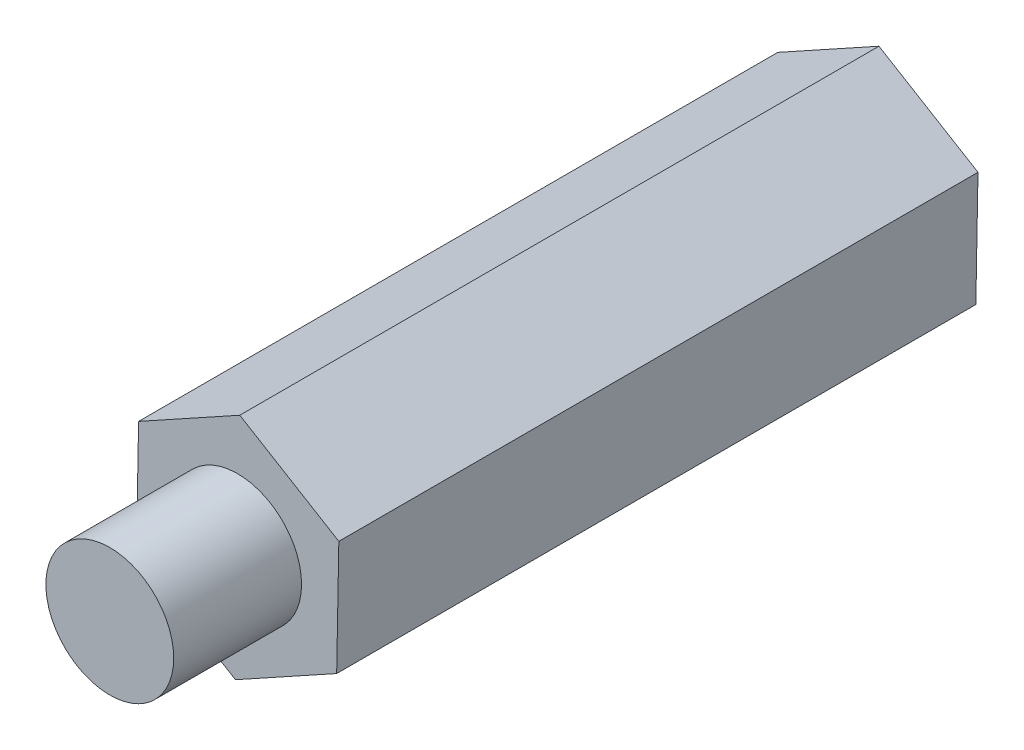
ISO-10303-21;
HEADER;
FILE_DESCRIPTION(('STEP AP214'),'2;1');
FILE_NAME('part.step','',(''),(''),'','','');
FILE_SCHEMA(('AUTOMOTIVE_DESIGN { 1 0 10303 214 1 1 1 1 }'));
ENDSEC;
DATA;
#1=APPLICATION_CONTEXT('core data for automotive mechanical design processes');
#2=APPLICATION_PROTOCOL_DEFINITION('international standard','automotive_design',2000,#1);
#3=PRODUCT_CONTEXT('',#1,'mechanical');
#4=PRODUCT('Part','Part','',(#3));
#5=PRODUCT_RELATED_PRODUCT_CATEGORY('part','',(#4));
#6=PRODUCT_DEFINITION_FORMATION('','',#4);
#7=PRODUCT_DEFINITION_CONTEXT('part definition',#1,'design');
#8=PRODUCT_DEFINITION('design','',#6,#7);
#9=PRODUCT_DEFINITION_SHAPE('','',#8);
#10=(LENGTH_UNIT() NAMED_UNIT(*) SI_UNIT(.MILLI.,.METRE.));
#11=(NAMED_UNIT(*) PLANE_ANGLE_UNIT() SI_UNIT($,.RADIAN.));
#12=(NAMED_UNIT(*) SI_UNIT($,.STERADIAN.) SOLID_ANGLE_UNIT());
#13=UNCERTAINTY_MEASURE_WITH_UNIT(LENGTH_MEASURE(1.E-05),#10,'distance_accuracy_value','');
#14=(GEOMETRIC_REPRESENTATION_CONTEXT(3) GLOBAL_UNCERTAINTY_ASSIGNED_CONTEXT((#13)) GLOBAL_UNIT_ASSIGNED_CONTEXT((#10,
#11,#12)) REPRESENTATION_CONTEXT('',''));
#15=CARTESIAN_POINT('',(0.,0.,0.));
#16=DIRECTION('',(0.,0.,1.));
#17=DIRECTION('',(1.,0.,0.));
#18=AXIS2_PLACEMENT_3D('',#15,#16,#17);
#19=CARTESIAN_POINT('',(0.0507511059576976,2.71307162798504,15.));
#20=DIRECTION('',(0.483715381528788,-0.875225359363209,0.));
#21=DIRECTION('',(0.875225359363209,0.483715381528788,0.));
#22=AXIS2_PLACEMENT_3D('',#19,#20,#21);
#23=PLANE('',#22);
#24=DIRECTION('',(-0.875225359363209,-0.483715381528788,0.));
#25=VECTOR('',#24,1.);
#26=CARTESIAN_POINT('',(0.0507511059576976,2.71307162798504,0.));
#27=LINE('',#26,#25);
#28=CARTESIAN_POINT('',(0.0507511059576976,2.71307162798504,0.));
#29=VERTEX_POINT('',#28);
#30=CARTESIAN_POINT('',(-2.324213399143,1.40048756102204,0.));
#31=VERTEX_POINT('',#30);
#32=EDGE_CURVE('E136',#29,#31,#27,.T.);
#33=ORIENTED_EDGE('',*,*,#32,.T.);
#34=DIRECTION('',(0.,0.,-1.));
#35=VECTOR('',#34,1.);
#36=CARTESIAN_POINT('',(-2.324213399143,1.40048756102204,15.));
#37=LINE('',#36,#35);
#38=CARTESIAN_POINT('',(-2.324213399143,1.40048756102204,15.));
#39=VERTEX_POINT('',#38);
#40=EDGE_CURVE('E48',#39,#31,#37,.T.);
#41=ORIENTED_EDGE('',*,*,#40,.F.);
#42=DIRECTION('',(-0.875225359363209,-0.483715381528788,0.));
#43=VECTOR('',#42,1.);
#44=CARTESIAN_POINT('',(0.0507511059576976,2.71307162798504,15.));
#45=LINE('',#44,#43);
#46=CARTESIAN_POINT('',(0.0507511059576976,2.71307162798504,15.));
#47=VERTEX_POINT('',#46);
#48=EDGE_CURVE('E153',#47,#39,#45,.T.);
#49=ORIENTED_EDGE('',*,*,#48,.F.);
#50=DIRECTION('',(0.,0.,-1.));
#51=VECTOR('',#50,1.);
#52=CARTESIAN_POINT('',(0.0507511059576976,2.71307162798504,15.));
#53=LINE('',#52,#51);
#54=EDGE_CURVE('E132',#47,#29,#53,.T.);
#55=ORIENTED_EDGE('',*,*,#54,.T.);
#56=EDGE_LOOP('',(#33,#41,#49,#55));
#57=FACE_BOUND('',#56,.T.);
#58=ADVANCED_FACE('F45',(#57),#23,.F.);
#59=CARTESIAN_POINT('',(-2.324213399143,1.40048756102204,15.));
#60=DIRECTION('',(0.999825086009298,-0.0187028710763916,0.));
#61=DIRECTION('',(0.0187028710763916,0.999825086009298,0.));
#62=AXIS2_PLACEMENT_3D('',#59,#60,#61);
#63=PLANE('',#62);
#64=DIRECTION('',(-0.0187028710763916,-0.999825086009298,0.));
#65=VECTOR('',#64,1.);
#66=CARTESIAN_POINT('',(-2.324213399143,1.40048756102204,0.));
#67=LINE('',#66,#65);
#68=CARTESIAN_POINT('',(-2.3749645051007,-1.312584066963,0.));
#69=VERTEX_POINT('',#68);
#70=EDGE_CURVE('E140',#31,#69,#67,.T.);
#71=ORIENTED_EDGE('',*,*,#70,.T.);
#72=DIRECTION('',(0.,0.,-1.));
#73=VECTOR('',#72,1.);
#74=CARTESIAN_POINT('',(-2.3749645051007,-1.312584066963,15.));
#75=LINE('',#74,#73);
#76=CARTESIAN_POINT('',(-2.3749645051007,-1.312584066963,15.));
#77=VERTEX_POINT('',#76);
#78=EDGE_CURVE('E159',#77,#69,#75,.T.);
#79=ORIENTED_EDGE('',*,*,#78,.F.);
#80=DIRECTION('',(-0.0187028710763916,-0.999825086009298,0.));
#81=VECTOR('',#80,1.);
#82=CARTESIAN_POINT('',(-2.324213399143,1.40048756102204,15.));
#83=LINE('',#82,#81);
#84=EDGE_CURVE('E101',#39,#77,#83,.T.);
#85=ORIENTED_EDGE('',*,*,#84,.F.);
#86=ORIENTED_EDGE('',*,*,#40,.T.);
#87=EDGE_LOOP('',(#71,#79,#85,#86));
#88=FACE_BOUND('',#87,.T.);
#89=ADVANCED_FACE('F166',(#88),#63,.F.);
#90=CARTESIAN_POINT('',(-2.3749645051007,-1.312584066963,15.));
#91=DIRECTION('',(0.51610970448051,0.856522488286817,0.));
#92=DIRECTION('',(-0.856522488286817,0.51610970448051,0.));
#93=AXIS2_PLACEMENT_3D('',#90,#91,#92);
#94=PLANE('',#93);
#95=DIRECTION('',(0.856522488286817,-0.51610970448051,0.));
#96=VECTOR('',#95,1.);
#97=CARTESIAN_POINT('',(-2.3749645051007,-1.312584066963,0.));
#98=LINE('',#97,#96);
#99=CARTESIAN_POINT('',(-0.0507511059576958,-2.71307162798504,0.));
#100=VERTEX_POINT('',#99);
#101=EDGE_CURVE('E144',#69,#100,#98,.T.);
#102=ORIENTED_EDGE('',*,*,#101,.T.);
#103=DIRECTION('',(0.,0.,-1.));
#104=VECTOR('',#103,1.);
#105=CARTESIAN_POINT('',(-0.0507511059576958,-2.71307162798504,15.));
#106=LINE('',#105,#104);
#107=CARTESIAN_POINT('',(-0.0507511059576958,-2.71307162798504,15.));
#108=VERTEX_POINT('',#107);
#109=EDGE_CURVE('E125',#108,#100,#106,.T.);
#110=ORIENTED_EDGE('',*,*,#109,.F.);
#111=DIRECTION('',(0.856522488286817,-0.51610970448051,0.));
#112=VECTOR('',#111,1.);
#113=CARTESIAN_POINT('',(-2.3749645051007,-1.312584066963,15.));
#114=LINE('',#113,#112);
#115=EDGE_CURVE('E114',#77,#108,#114,.T.);
#116=ORIENTED_EDGE('',*,*,#115,.F.);
#117=ORIENTED_EDGE('',*,*,#78,.T.);
#118=EDGE_LOOP('',(#102,#110,#116,#117));
#119=FACE_BOUND('',#118,.T.);
#120=ADVANCED_FACE('F172',(#119),#94,.F.);
#121=CARTESIAN_POINT('',(-0.0507511059576958,-2.71307162798504,15.));
#122=DIRECTION('',(-0.483715381528788,0.875225359363209,0.));
#123=DIRECTION('',(-0.87522535936321,-0.483715381528788,0.));
#124=AXIS2_PLACEMENT_3D('',#121,#122,#123);
#125=PLANE('',#124);
#126=DIRECTION('',(0.875225359363209,0.483715381528788,0.));
#127=VECTOR('',#126,1.);
#128=CARTESIAN_POINT('',(-0.0507511059576958,-2.71307162798504,0.));
#129=LINE('',#128,#127);
#130=CARTESIAN_POINT('',(2.324213399143,-1.40048756102204,0.));
#131=VERTEX_POINT('',#130);
#132=EDGE_CURVE('E123',#100,#131,#129,.T.);
#133=ORIENTED_EDGE('',*,*,#132,.T.);
#134=DIRECTION('',(0.,0.,-1.));
#135=VECTOR('',#134,1.);
#136=CARTESIAN_POINT('',(2.324213399143,-1.40048756102204,15.));
#137=LINE('',#136,#135);
#138=CARTESIAN_POINT('',(2.324213399143,-1.40048756102204,15.));
#139=VERTEX_POINT('',#138);
#140=EDGE_CURVE('E120',#139,#131,#137,.T.);
#141=ORIENTED_EDGE('',*,*,#140,.F.);
#142=DIRECTION('',(0.875225359363209,0.483715381528788,0.));
#143=VECTOR('',#142,1.);
#144=CARTESIAN_POINT('',(-0.0507511059576958,-2.71307162798504,15.));
#145=LINE('',#144,#143);
#146=EDGE_CURVE('E108',#108,#139,#145,.T.);
#147=ORIENTED_EDGE('',*,*,#146,.F.);
#148=ORIENTED_EDGE('',*,*,#109,.T.);
#149=EDGE_LOOP('',(#133,#141,#147,#148));
#150=FACE_BOUND('',#149,.T.);
#151=ADVANCED_FACE('F121',(#150),#125,.F.);
#152=CARTESIAN_POINT('',(2.324213399143,-1.40048756102204,15.));
#153=DIRECTION('',(-0.999825086009298,0.0187028710763917,0.));
#154=DIRECTION('',(-0.0187028710763917,-0.999825086009298,0.));
#155=AXIS2_PLACEMENT_3D('',#152,#153,#154);
#156=PLANE('',#155);
#157=DIRECTION('',(0.0187028710763917,0.999825086009298,0.));
#158=VECTOR('',#157,1.);
#159=CARTESIAN_POINT('',(2.324213399143,-1.40048756102204,0.));
#160=LINE('',#159,#158);
#161=CARTESIAN_POINT('',(2.3749645051007,1.312584066963,0.));
#162=VERTEX_POINT('',#161);
#163=EDGE_CURVE('E86',#131,#162,#160,.T.);
#164=ORIENTED_EDGE('',*,*,#163,.T.);
#165=DIRECTION('',(0.,0.,-1.));
#166=VECTOR('',#165,1.);
#167=CARTESIAN_POINT('',(2.3749645051007,1.312584066963,15.));
#168=LINE('',#167,#166);
#169=CARTESIAN_POINT('',(2.3749645051007,1.312584066963,15.));
#170=VERTEX_POINT('',#169);
#171=EDGE_CURVE('E126',#170,#162,#168,.T.);
#172=ORIENTED_EDGE('',*,*,#171,.F.);
#173=DIRECTION('',(0.0187028710763917,0.999825086009298,0.));
#174=VECTOR('',#173,1.);
#175=CARTESIAN_POINT('',(2.324213399143,-1.40048756102204,15.));
#176=LINE('',#175,#174);
#177=EDGE_CURVE('E112',#139,#170,#176,.T.);
#178=ORIENTED_EDGE('',*,*,#177,.F.);
#179=ORIENTED_EDGE('',*,*,#140,.T.);
#180=EDGE_LOOP('',(#164,#172,#178,#179));
#181=FACE_BOUND('',#180,.T.);
#182=ADVANCED_FACE('F128',(#181),#156,.F.);
#183=CARTESIAN_POINT('',(2.3749645051007,1.312584066963,15.));
#184=DIRECTION('',(-0.51610970448051,-0.856522488286817,0.));
#185=DIRECTION('',(0.856522488286817,-0.51610970448051,0.));
#186=AXIS2_PLACEMENT_3D('',#183,#184,#185);
#187=PLANE('',#186);
#188=DIRECTION('',(-0.856522488286817,0.51610970448051,0.));
#189=VECTOR('',#188,1.);
#190=CARTESIAN_POINT('',(2.3749645051007,1.312584066963,0.));
#191=LINE('',#190,#189);
#192=EDGE_CURVE('E92',#162,#29,#191,.T.);
#193=ORIENTED_EDGE('',*,*,#192,.T.);
#194=ORIENTED_EDGE('',*,*,#54,.F.);
#195=DIRECTION('',(-0.856522488286817,0.51610970448051,0.));
#196=VECTOR('',#195,1.);
#197=CARTESIAN_POINT('',(2.3749645051007,1.312584066963,15.));
#198=LINE('',#197,#196);
#199=EDGE_CURVE('E63',#170,#47,#198,.T.);
#200=ORIENTED_EDGE('',*,*,#199,.F.);
#201=ORIENTED_EDGE('',*,*,#171,.T.);
#202=EDGE_LOOP('',(#193,#194,#200,#201));
#203=FACE_BOUND('',#202,.T.);
#204=ADVANCED_FACE('F209',(#203),#187,.F.);
#205=CARTESIAN_POINT('',(0.,0.,15.));
#206=DIRECTION('',(0.,0.,1.));
#207=DIRECTION('',(1.,0.,0.));
#208=AXIS2_PLACEMENT_3D('',#205,#206,#207);
#209=PLANE('',#208);
#210=CARTESIAN_POINT('',(0.,0.,15.));
#211=DIRECTION('',(0.,0.,1.));
#212=DIRECTION('',(1.,0.,0.));
#213=AXIS2_PLACEMENT_3D('',#210,#211,#212);
#214=CIRCLE('',#213,1.5);
#215=CARTESIAN_POINT('',(1.5,0.,15.));
#216=VERTEX_POINT('',#215);
#217=EDGE_CURVE('E11',#216,#216,#214,.T.);
#218=ORIENTED_EDGE('',*,*,#217,.F.);
#219=EDGE_LOOP('',(#218));
#220=FACE_BOUND('',#219,.T.);
#221=ORIENTED_EDGE('',*,*,#48,.T.);
#222=ORIENTED_EDGE('',*,*,#84,.T.);
#223=ORIENTED_EDGE('',*,*,#115,.T.);
#224=ORIENTED_EDGE('',*,*,#146,.T.);
#225=ORIENTED_EDGE('',*,*,#177,.T.);
#226=ORIENTED_EDGE('',*,*,#199,.T.);
#227=EDGE_LOOP('',(#221,#222,#223,#224,#225,#226));
#228=FACE_BOUND('',#227,.T.);
#229=ADVANCED_FACE('F110',(#220,#228),#209,.T.);
#230=CARTESIAN_POINT('',(0.,0.,0.));
#231=DIRECTION('',(0.,0.,1.));
#232=DIRECTION('',(1.,0.,0.));
#233=AXIS2_PLACEMENT_3D('',#230,#231,#232);
#234=PLANE('',#233);
#235=CARTESIAN_POINT('',(0.,0.,0.));
#236=DIRECTION('',(0.,0.,-1.));
#237=DIRECTION('',(-1.,0.,0.));
#238=AXIS2_PLACEMENT_3D('',#235,#236,#237);
#239=CIRCLE('',#238,1.5);
#240=CARTESIAN_POINT('',(-1.5,0.,0.));
#241=VERTEX_POINT('',#240);
#242=EDGE_CURVE('E183',#241,#241,#239,.T.);
#243=ORIENTED_EDGE('',*,*,#242,.F.);
#244=EDGE_LOOP('',(#243));
#245=FACE_BOUND('',#244,.T.);
#246=ORIENTED_EDGE('',*,*,#32,.F.);
#247=ORIENTED_EDGE('',*,*,#192,.F.);
#248=ORIENTED_EDGE('',*,*,#163,.F.);
#249=ORIENTED_EDGE('',*,*,#132,.F.);
#250=ORIENTED_EDGE('',*,*,#101,.F.);
#251=ORIENTED_EDGE('',*,*,#70,.F.);
#252=EDGE_LOOP('',(#246,#247,#248,#249,#250,#251));
#253=FACE_BOUND('',#252,.T.);
#254=ADVANCED_FACE('F171',(#245,#253),#234,.F.);
#255=CARTESIAN_POINT('',(0.,0.,18.));
#256=DIRECTION('',(0.,0.,-1.));
#257=DIRECTION('',(-1.,0.,0.));
#258=AXIS2_PLACEMENT_3D('',#255,#256,#257);
#259=CYLINDRICAL_SURFACE('',#258,1.5);
#260=CARTESIAN_POINT('',(0.,0.,18.));
#261=DIRECTION('',(0.,0.,1.));
#262=DIRECTION('',(1.,0.,0.));
#263=AXIS2_PLACEMENT_3D('',#260,#261,#262);
#264=CIRCLE('',#263,1.5);
#265=CARTESIAN_POINT('',(1.5,0.,18.));
#266=VERTEX_POINT('',#265);
#267=EDGE_CURVE('E141',#266,#266,#264,.T.);
#268=ORIENTED_EDGE('',*,*,#267,.F.);
#269=EDGE_LOOP('',(#268));
#270=FACE_BOUND('',#269,.T.);
#271=ORIENTED_EDGE('',*,*,#217,.T.);
#272=EDGE_LOOP('',(#271));
#273=FACE_BOUND('',#272,.T.);
#274=ADVANCED_FACE('F201',(#270,#273),#259,.T.);
#275=CARTESIAN_POINT('',(0.,0.,18.));
#276=DIRECTION('',(0.,0.,1.));
#277=DIRECTION('',(1.,0.,0.));
#278=AXIS2_PLACEMENT_3D('',#275,#276,#277);
#279=PLANE('',#278);
#280=ORIENTED_EDGE('',*,*,#267,.T.);
#281=EDGE_LOOP('',(#280));
#282=FACE_BOUND('',#281,.T.);
#283=ADVANCED_FACE('F196',(#282),#279,.T.);
#284=CARTESIAN_POINT('',(0.,0.,3.));
#285=DIRECTION('',(0.,0.,-1.));
#286=DIRECTION('',(-1.,0.,0.));
#287=AXIS2_PLACEMENT_3D('',#284,#285,#286);
#288=CYLINDRICAL_SURFACE('',#287,1.5);
#289=CARTESIAN_POINT('',(0.,0.,3.));
#290=DIRECTION('',(0.,0.,-1.));
#291=DIRECTION('',(-1.,0.,0.));
#292=AXIS2_PLACEMENT_3D('',#289,#290,#291);
#293=CIRCLE('',#292,1.5);
#294=CARTESIAN_POINT('',(-1.5,0.,3.));
#295=VERTEX_POINT('',#294);
#296=EDGE_CURVE('E182',#295,#295,#293,.T.);
#297=ORIENTED_EDGE('',*,*,#296,.F.);
#298=EDGE_LOOP('',(#297));
#299=FACE_BOUND('',#298,.T.);
#300=ORIENTED_EDGE('',*,*,#242,.T.);
#301=EDGE_LOOP('',(#300));
#302=FACE_BOUND('',#301,.T.);
#303=ADVANCED_FACE('F193',(#299,#302),#288,.F.);
#304=CARTESIAN_POINT('',(0.,0.,3.));
#305=DIRECTION('',(0.,0.,-1.));
#306=DIRECTION('',(-1.,0.,0.));
#307=AXIS2_PLACEMENT_3D('',#304,#305,#306);
#308=PLANE('',#307);
#309=ORIENTED_EDGE('',*,*,#296,.T.);
#310=EDGE_LOOP('',(#309));
#311=FACE_BOUND('',#310,.T.);
#312=ADVANCED_FACE('F191',(#311),#308,.T.);
#313=CLOSED_SHELL('',(#58,#89,#120,#151,#182,#204,#229,#254,#274,#283,#303,#312));
#314=MANIFOLD_SOLID_BREP('B2',#313);
#315=ADVANCED_BREP_SHAPE_REPRESENTATION('',(#18,#314),#14);
#316=SHAPE_DEFINITION_REPRESENTATION(#9,#315);
ENDSEC;
END-ISO-10303-21;
